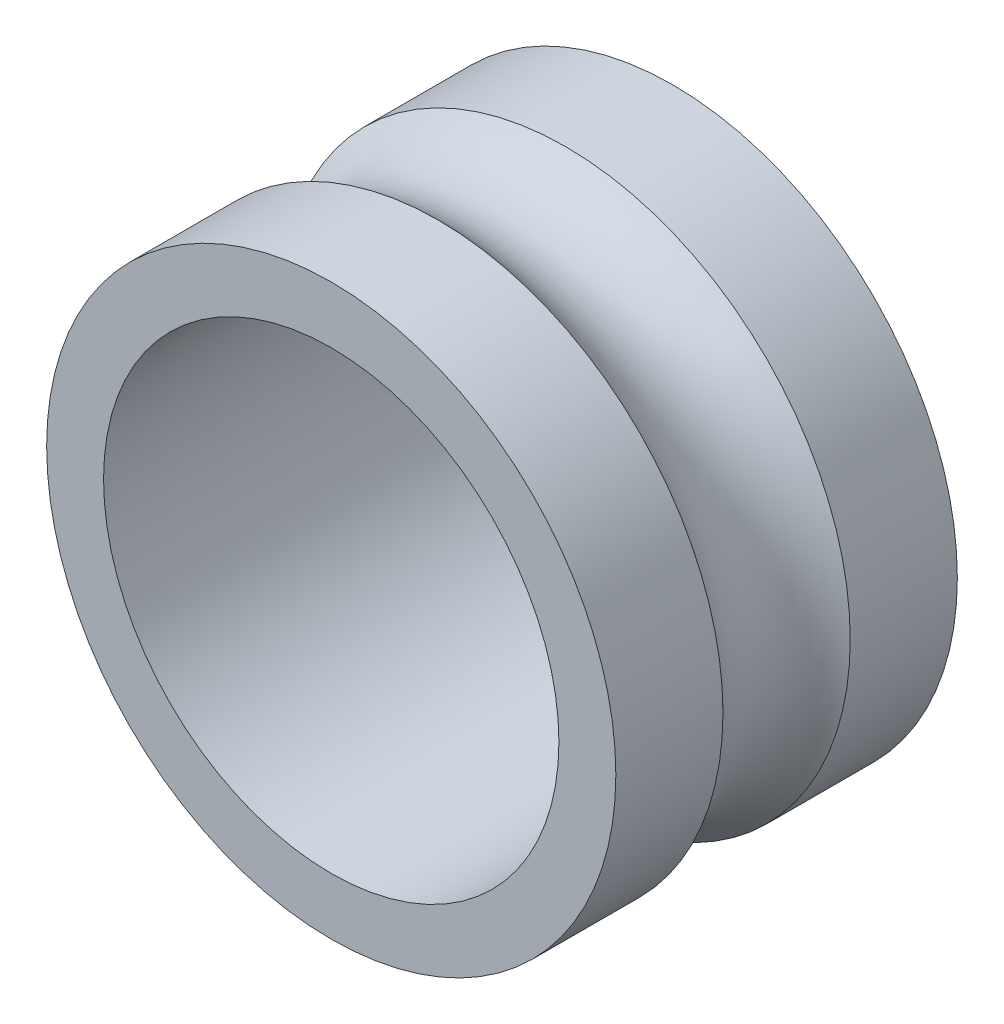
ISO-10303-21;
HEADER;
FILE_DESCRIPTION(('STEP AP214'),'2;1');
FILE_NAME('part.step','',(''),(''),'','','');
FILE_SCHEMA(('AUTOMOTIVE_DESIGN { 1 0 10303 214 1 1 1 1 }'));
ENDSEC;
DATA;
#1=APPLICATION_CONTEXT('core data for automotive mechanical design processes');
#2=APPLICATION_PROTOCOL_DEFINITION('international standard','automotive_design',2000,#1);
#3=PRODUCT_CONTEXT('',#1,'mechanical');
#4=PRODUCT('Part','Part','',(#3));
#5=PRODUCT_RELATED_PRODUCT_CATEGORY('part','',(#4));
#6=PRODUCT_DEFINITION_FORMATION('','',#4);
#7=PRODUCT_DEFINITION_CONTEXT('part definition',#1,'design');
#8=PRODUCT_DEFINITION('design','',#6,#7);
#9=PRODUCT_DEFINITION_SHAPE('','',#8);
#10=(LENGTH_UNIT() NAMED_UNIT(*) SI_UNIT(.MILLI.,.METRE.));
#11=(NAMED_UNIT(*) PLANE_ANGLE_UNIT() SI_UNIT($,.RADIAN.));
#12=(NAMED_UNIT(*) SI_UNIT($,.STERADIAN.) SOLID_ANGLE_UNIT());
#13=UNCERTAINTY_MEASURE_WITH_UNIT(LENGTH_MEASURE(1.E-05),#10,'distance_accuracy_value','');
#14=(GEOMETRIC_REPRESENTATION_CONTEXT(3) GLOBAL_UNCERTAINTY_ASSIGNED_CONTEXT((#13)) GLOBAL_UNIT_ASSIGNED_CONTEXT((#10,
#11,#12)) REPRESENTATION_CONTEXT('',''));
#15=CARTESIAN_POINT('',(0.,0.,0.));
#16=DIRECTION('',(0.,0.,1.));
#17=DIRECTION('',(1.,0.,0.));
#18=AXIS2_PLACEMENT_3D('',#15,#16,#17);
#19=CARTESIAN_POINT('',(0.,0.,1.5));
#20=DIRECTION('',(0.,0.,-1.));
#21=DIRECTION('',(-1.,0.,0.));
#22=AXIS2_PLACEMENT_3D('',#19,#20,#21);
#23=CYLINDRICAL_SURFACE('',#22,2.5);
#24=CARTESIAN_POINT('',(0.,0.,-1.5));
#25=DIRECTION('',(0.,0.,1.));
#26=DIRECTION('',(1.,0.,0.));
#27=AXIS2_PLACEMENT_3D('',#24,#25,#26);
#28=CIRCLE('',#27,2.5);
#29=CARTESIAN_POINT('',(2.5,0.,-1.5));
#30=VERTEX_POINT('',#29);
#31=EDGE_CURVE('E33',#30,#30,#28,.T.);
#32=ORIENTED_EDGE('',*,*,#31,.T.);
#33=EDGE_LOOP('',(#32));
#34=FACE_BOUND('',#33,.T.);
#35=CARTESIAN_POINT('',(0.,0.,-0.559016994374947));
#36=DIRECTION('',(0.,0.,-1.));
#37=DIRECTION('',(-1.,0.,0.));
#38=AXIS2_PLACEMENT_3D('',#35,#36,#37);
#39=CIRCLE('',#38,2.5);
#40=CARTESIAN_POINT('',(-2.5,0.,-0.559016994374947));
#41=VERTEX_POINT('',#40);
#42=EDGE_CURVE('E50',#41,#41,#39,.T.);
#43=ORIENTED_EDGE('',*,*,#42,.T.);
#44=EDGE_LOOP('',(#43));
#45=FACE_BOUND('',#44,.T.);
#46=ADVANCED_FACE('F30',(#34,#45),#23,.T.);
#47=CARTESIAN_POINT('',(0.,0.,1.5));
#48=DIRECTION('',(0.,0.,1.));
#49=DIRECTION('',(1.,0.,0.));
#50=AXIS2_PLACEMENT_3D('',#47,#48,#49);
#51=CIRCLE('',#50,2.5);
#52=CARTESIAN_POINT('',(2.5,0.,1.5));
#53=VERTEX_POINT('',#52);
#54=EDGE_CURVE('E10',#53,#53,#51,.T.);
#55=ORIENTED_EDGE('',*,*,#54,.F.);
#56=EDGE_LOOP('',(#55));
#57=FACE_BOUND('',#56,.T.);
#58=CARTESIAN_POINT('',(0.,0.,0.559016994374947));
#59=DIRECTION('',(0.,0.,-1.));
#60=DIRECTION('',(-1.,0.,0.));
#61=AXIS2_PLACEMENT_3D('',#58,#59,#60);
#62=CIRCLE('',#61,2.5);
#63=CARTESIAN_POINT('',(-2.5,0.,0.559016994374948));
#64=VERTEX_POINT('',#63);
#65=EDGE_CURVE('E45',#64,#64,#62,.T.);
#66=ORIENTED_EDGE('',*,*,#65,.F.);
#67=EDGE_LOOP('',(#66));
#68=FACE_BOUND('',#67,.T.);
#69=ADVANCED_FACE('F67',(#57,#68),#23,.T.);
#70=CARTESIAN_POINT('',(0.,0.,1.5));
#71=DIRECTION('',(0.,0.,1.));
#72=DIRECTION('',(1.,0.,0.));
#73=AXIS2_PLACEMENT_3D('',#70,#71,#72);
#74=PLANE('',#73);
#75=ORIENTED_EDGE('',*,*,#54,.T.);
#76=EDGE_LOOP('',(#75));
#77=FACE_BOUND('',#76,.T.);
#78=CARTESIAN_POINT('',(0.,0.,1.5));
#79=DIRECTION('',(0.,0.,1.));
#80=DIRECTION('',(1.,0.,0.));
#81=AXIS2_PLACEMENT_3D('',#78,#79,#80);
#82=CIRCLE('',#81,2.);
#83=CARTESIAN_POINT('',(2.,0.,1.5));
#84=VERTEX_POINT('',#83);
#85=EDGE_CURVE('E40',#84,#84,#82,.T.);
#86=ORIENTED_EDGE('',*,*,#85,.F.);
#87=EDGE_LOOP('',(#86));
#88=FACE_BOUND('',#87,.T.);
#89=ADVANCED_FACE('F72',(#77,#88),#74,.T.);
#90=CARTESIAN_POINT('',(0.,0.,-1.5));
#91=DIRECTION('',(0.,0.,1.));
#92=DIRECTION('',(1.,0.,0.));
#93=AXIS2_PLACEMENT_3D('',#90,#91,#92);
#94=PLANE('',#93);
#95=ORIENTED_EDGE('',*,*,#31,.F.);
#96=EDGE_LOOP('',(#95));
#97=FACE_BOUND('',#96,.T.);
#98=CARTESIAN_POINT('',(0.,0.,-1.5));
#99=DIRECTION('',(0.,0.,1.));
#100=DIRECTION('',(1.,0.,0.));
#101=AXIS2_PLACEMENT_3D('',#98,#99,#100);
#102=CIRCLE('',#101,2.);
#103=CARTESIAN_POINT('',(2.,0.,-1.5));
#104=VERTEX_POINT('',#103);
#105=EDGE_CURVE('E42',#104,#104,#102,.T.);
#106=ORIENTED_EDGE('',*,*,#105,.T.);
#107=EDGE_LOOP('',(#106));
#108=FACE_BOUND('',#107,.T.);
#109=ADVANCED_FACE('F63',(#97,#108),#94,.F.);
#110=CARTESIAN_POINT('',(0.,0.,1.5));
#111=DIRECTION('',(0.,0.,-1.));
#112=DIRECTION('',(-1.,0.,0.));
#113=AXIS2_PLACEMENT_3D('',#110,#111,#112);
#114=CYLINDRICAL_SURFACE('',#113,2.);
#115=ORIENTED_EDGE('',*,*,#85,.T.);
#116=EDGE_LOOP('',(#115));
#117=FACE_BOUND('',#116,.T.);
#118=ORIENTED_EDGE('',*,*,#105,.F.);
#119=EDGE_LOOP('',(#118));
#120=FACE_BOUND('',#119,.T.);
#121=ADVANCED_FACE('F57',(#117,#120),#114,.F.);
#122=CARTESIAN_POINT('',(0.,0.,0.));
#123=DIRECTION('',(0.,0.,-1.));
#124=DIRECTION('',(-1.,0.,0.));
#125=AXIS2_PLACEMENT_3D('',#122,#123,#124);
#126=TOROIDAL_SURFACE('',#125,3.,0.75);
#127=ORIENTED_EDGE('',*,*,#65,.T.);
#128=EDGE_LOOP('',(#127));
#129=FACE_BOUND('',#128,.T.);
#130=ORIENTED_EDGE('',*,*,#42,.F.);
#131=EDGE_LOOP('',(#130));
#132=FACE_BOUND('',#131,.T.);
#133=ADVANCED_FACE('F55',(#129,#132),#126,.F.);
#134=CLOSED_SHELL('',(#46,#69,#89,#109,#121,#133));
#135=MANIFOLD_SOLID_BREP('B2',#134);
#136=ADVANCED_BREP_SHAPE_REPRESENTATION('',(#18,#135),#14);
#137=SHAPE_DEFINITION_REPRESENTATION(#9,#136);
ENDSEC;
END-ISO-10303-21;
